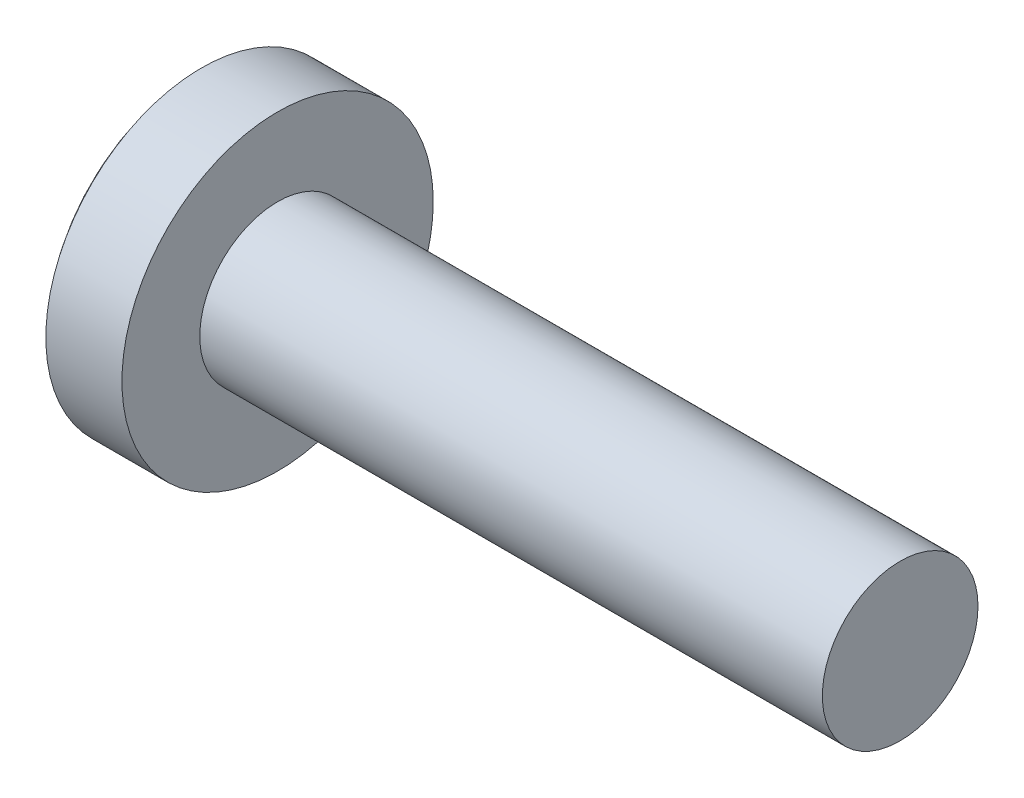
ISO-10303-21;
HEADER;
FILE_DESCRIPTION(('STEP AP214'),'2;1');
FILE_NAME('part.step','',(''),(''),'','','');
FILE_SCHEMA(('AUTOMOTIVE_DESIGN { 1 0 10303 214 1 1 1 1 }'));
ENDSEC;
DATA;
#1=APPLICATION_CONTEXT('core data for automotive mechanical design processes');
#2=APPLICATION_PROTOCOL_DEFINITION('international standard','automotive_design',2000,#1);
#3=PRODUCT_CONTEXT('',#1,'mechanical');
#4=PRODUCT('Part','Part','',(#3));
#5=PRODUCT_RELATED_PRODUCT_CATEGORY('part','',(#4));
#6=PRODUCT_DEFINITION_FORMATION('','',#4);
#7=PRODUCT_DEFINITION_CONTEXT('part definition',#1,'design');
#8=PRODUCT_DEFINITION('design','',#6,#7);
#9=PRODUCT_DEFINITION_SHAPE('','',#8);
#10=(LENGTH_UNIT() NAMED_UNIT(*) SI_UNIT(.MILLI.,.METRE.));
#11=(NAMED_UNIT(*) PLANE_ANGLE_UNIT() SI_UNIT($,.RADIAN.));
#12=(NAMED_UNIT(*) SI_UNIT($,.STERADIAN.) SOLID_ANGLE_UNIT());
#13=UNCERTAINTY_MEASURE_WITH_UNIT(LENGTH_MEASURE(1.E-05),#10,'distance_accuracy_value','');
#14=(GEOMETRIC_REPRESENTATION_CONTEXT(3) GLOBAL_UNCERTAINTY_ASSIGNED_CONTEXT((#13)) GLOBAL_UNIT_ASSIGNED_CONTEXT((#10,
#11,#12)) REPRESENTATION_CONTEXT('',''));
#15=CARTESIAN_POINT('',(0.,0.,0.));
#16=DIRECTION('',(0.,0.,1.));
#17=DIRECTION('',(1.,0.,0.));
#18=AXIS2_PLACEMENT_3D('',#15,#16,#17);
#19=CARTESIAN_POINT('',(1.47,0.27,0.27));
#20=DIRECTION('',(1.,0.,0.));
#21=DIRECTION('',(0.,0.,-1.));
#22=AXIS2_PLACEMENT_3D('',#19,#20,#21);
#23=PLANE('',#22);
#24=CARTESIAN_POINT('',(1.47,0.57,0.57));
#25=DIRECTION('',(-1.,0.,0.));
#26=DIRECTION('',(0.,0.,1.));
#27=AXIS2_PLACEMENT_3D('',#24,#25,#26);
#28=CIRCLE('',#27,0.3);
#29=CARTESIAN_POINT('',(1.47,0.501295104291248,0.277973225019264));
#30=VERTEX_POINT('',#29);
#31=CARTESIAN_POINT('',(1.47,0.277973225019264,0.501295104291247));
#32=VERTEX_POINT('',#31);
#33=EDGE_CURVE('E19',#30,#32,#28,.T.);
#34=ORIENTED_EDGE('',*,*,#33,.F.);
#35=DIRECTION('',(0.,0.,1.));
#36=VECTOR('',#35,1.);
#37=CARTESIAN_POINT('',(1.47,0.501295104291248,0.));
#38=LINE('',#37,#36);
#39=CARTESIAN_POINT('',(1.47,0.501295104291248,-0.277973225019264));
#40=VERTEX_POINT('',#39);
#41=EDGE_CURVE('E129',#40,#30,#38,.T.);
#42=ORIENTED_EDGE('',*,*,#41,.F.);
#43=CARTESIAN_POINT('',(1.47,0.57,-0.57));
#44=DIRECTION('',(-1.,0.,0.));
#45=DIRECTION('',(0.,0.,1.));
#46=AXIS2_PLACEMENT_3D('',#43,#44,#45);
#47=CIRCLE('',#46,0.3);
#48=CARTESIAN_POINT('',(1.47,0.277973225019264,-0.501295104291247));
#49=VERTEX_POINT('',#48);
#50=EDGE_CURVE('E270',#49,#40,#47,.T.);
#51=ORIENTED_EDGE('',*,*,#50,.F.);
#52=DIRECTION('',(0.,1.,0.));
#53=VECTOR('',#52,1.);
#54=CARTESIAN_POINT('',(1.47,0.,-0.501295104291247));
#55=LINE('',#54,#53);
#56=CARTESIAN_POINT('',(1.47,-0.277973225019264,-0.501295104291247));
#57=VERTEX_POINT('',#56);
#58=EDGE_CURVE('E152',#57,#49,#55,.T.);
#59=ORIENTED_EDGE('',*,*,#58,.F.);
#60=CARTESIAN_POINT('',(1.47,-0.57,-0.57));
#61=DIRECTION('',(-1.,0.,0.));
#62=DIRECTION('',(0.,0.,1.));
#63=AXIS2_PLACEMENT_3D('',#60,#61,#62);
#64=CIRCLE('',#63,0.3);
#65=CARTESIAN_POINT('',(1.47,-0.501295104291248,-0.277973225019264));
#66=VERTEX_POINT('',#65);
#67=EDGE_CURVE('E288',#66,#57,#64,.T.);
#68=ORIENTED_EDGE('',*,*,#67,.F.);
#69=DIRECTION('',(0.,0.,1.));
#70=VECTOR('',#69,1.);
#71=CARTESIAN_POINT('',(1.47,-0.501295104291248,0.));
#72=LINE('',#71,#70);
#73=CARTESIAN_POINT('',(1.47,-0.501295104291248,0.277973225019264));
#74=VERTEX_POINT('',#73);
#75=EDGE_CURVE('E157',#74,#66,#72,.F.);
#76=ORIENTED_EDGE('',*,*,#75,.F.);
#77=CARTESIAN_POINT('',(1.47,-0.57,0.57));
#78=DIRECTION('',(-1.,0.,0.));
#79=DIRECTION('',(0.,0.,1.));
#80=AXIS2_PLACEMENT_3D('',#77,#78,#79);
#81=CIRCLE('',#80,0.3);
#82=CARTESIAN_POINT('',(1.47,-0.277973225019264,0.501295104291247));
#83=VERTEX_POINT('',#82);
#84=EDGE_CURVE('E319',#83,#74,#81,.T.);
#85=ORIENTED_EDGE('',*,*,#84,.F.);
#86=DIRECTION('',(0.,1.,0.));
#87=VECTOR('',#86,1.);
#88=CARTESIAN_POINT('',(1.47,0.,0.501295104291247));
#89=LINE('',#88,#87);
#90=EDGE_CURVE('E132',#32,#83,#89,.F.);
#91=ORIENTED_EDGE('',*,*,#90,.F.);
#92=EDGE_LOOP('',(#34,#42,#51,#59,#68,#76,#85,#91));
#93=FACE_BOUND('',#92,.T.);
#94=ADVANCED_FACE('F16',(#93),#23,.F.);
#95=CARTESIAN_POINT('',(1.47,0.57,0.57));
#96=DIRECTION('',(-1.,0.,0.));
#97=DIRECTION('',(0.,0.,1.));
#98=AXIS2_PLACEMENT_3D('',#95,#96,#97);
#99=CYLINDRICAL_SURFACE('',#98,0.3);
#100=DIRECTION('',(1.,0.,0.));
#101=VECTOR('',#100,1.);
#102=CARTESIAN_POINT('',(1.47,0.57,0.27));
#103=LINE('',#102,#101);
#104=CARTESIAN_POINT('',(1.35099962990372,0.57,0.27));
#105=VERTEX_POINT('',#104);
#106=CARTESIAN_POINT('',(0.0500379748660876,0.57,0.27));
#107=VERTEX_POINT('',#106);
#108=EDGE_CURVE('E140',#105,#107,#103,.F.);
#109=ORIENTED_EDGE('',*,*,#108,.F.);
#110=CARTESIAN_POINT('',(1.35099962990372,0.57,0.57));
#111=DIRECTION('',(-0.500000000000001,-0.866025403784438,0.));
#112=DIRECTION('',(-0.866025403784438,0.500000000000001,0.));
#113=AXIS2_PLACEMENT_3D('',#110,#111,#112);
#114=ELLIPSE('',#113,0.599999999999999,0.3);
#115=EDGE_CURVE('E137',#30,#105,#114,.F.);
#116=ORIENTED_EDGE('',*,*,#115,.F.);
#117=ORIENTED_EDGE('',*,*,#33,.T.);
#118=CARTESIAN_POINT('',(1.35099962990372,0.57,0.57));
#119=DIRECTION('',(-0.500000000000001,0.,-0.866025403784438));
#120=DIRECTION('',(-0.866025403784438,0.,0.500000000000001));
#121=AXIS2_PLACEMENT_3D('',#118,#119,#120);
#122=ELLIPSE('',#121,0.599999999999999,0.3);
#123=CARTESIAN_POINT('',(1.35099962990372,0.27,0.57));
#124=VERTEX_POINT('',#123);
#125=EDGE_CURVE('E163',#124,#32,#122,.F.);
#126=ORIENTED_EDGE('',*,*,#125,.F.);
#127=DIRECTION('',(1.,0.,0.));
#128=VECTOR('',#127,1.);
#129=CARTESIAN_POINT('',(1.47,0.27,0.57));
#130=LINE('',#129,#128);
#131=CARTESIAN_POINT('',(0.0500379748660873,0.27,0.57));
#132=VERTEX_POINT('',#131);
#133=EDGE_CURVE('E342',#132,#124,#130,.T.);
#134=ORIENTED_EDGE('',*,*,#133,.F.);
#135=CARTESIAN_POINT('',(0.0500379748660873,0.269999999999999,0.57));
#136=CARTESIAN_POINT('',(0.0476365193072019,0.269985184718192,0.553373133693541));
#137=CARTESIAN_POINT('',(0.0454365535761343,0.27138160203282,0.536716442967316));
#138=CARTESIAN_POINT('',(0.041494524220516,0.276920923649693,0.503814466627408));
#139=CARTESIAN_POINT('',(0.0397523598629176,0.281063223049623,0.487569091221413));
#140=CARTESIAN_POINT('',(0.036778374566567,0.292023459728197,0.455938435457178));
#141=CARTESIAN_POINT('',(0.0355470274058542,0.298843869569156,0.440553964967674));
#142=CARTESIAN_POINT('',(0.0336346249010352,0.314973582618152,0.411119958233409));
#143=CARTESIAN_POINT('',(0.0329533539015007,0.32428190854053,0.3970699007448));
#144=CARTESIAN_POINT('',(0.0321660944268172,0.345013208977959,0.370858942562679));
#145=CARTESIAN_POINT('',(0.0320539196934614,0.356412041876083,0.358679128892844));
#146=CARTESIAN_POINT('',(0.0323915833576584,0.381063919968772,0.336377730121749));
#147=CARTESIAN_POINT('',(0.0328414084664962,0.394316921314189,0.326256096360568));
#148=CARTESIAN_POINT('',(0.0342854793268387,0.422222752109676,0.308399048507584));
#149=CARTESIAN_POINT('',(0.035277058409756,0.436868437061245,0.300652234107461));
#150=CARTESIAN_POINT('',(0.0377733495233277,0.467195795819663,0.287682728115111));
#151=CARTESIAN_POINT('',(0.0392779218148236,0.482877186563697,0.282459350075276));
#152=CARTESIAN_POINT('',(0.0422857123404821,0.510516712878049,0.275710673998405));
#153=CARTESIAN_POINT('',(0.0436802006877329,0.522340388950019,0.273568318144529));
#154=CARTESIAN_POINT('',(0.0466949687188353,0.546113272121096,0.270712687134809));
#155=CARTESIAN_POINT('',(0.0483149209970562,0.558062274372233,0.2699973624182));
#156=CARTESIAN_POINT('',(0.0500379748660879,0.57,0.27));
#157=B_SPLINE_CURVE_WITH_KNOTS('',3,(#135,#136,#137,#138,#139,#140,#141,#142,#143,#144,#145,
#146,#147,#148,#149,#150,#151,#152,#153,#154,#155,#156),.UNSPECIFIED.,.F.,.F.,(4,2,2,2,2,2,2,2,
2,2,4),(0.,0.0503402470596833,0.100669408130982,0.151045145210377,0.20140112305631,
0.251208524397358,0.301014748044423,0.350577991416719,0.400127744552091,0.436335022834785,
0.472490261189751),.UNSPECIFIED.);
#158=EDGE_CURVE('E135',#132,#107,#157,.T.);
#159=ORIENTED_EDGE('',*,*,#158,.T.);
#160=EDGE_LOOP('',(#109,#116,#117,#126,#134,#159));
#161=FACE_BOUND('',#160,.T.);
#162=ADVANCED_FACE('F138',(#161),#99,.T.);
#163=CARTESIAN_POINT('',(0.,0.,1.35));
#164=DIRECTION('',(-0.500000000000001,0.,-0.866025403784438));
#165=DIRECTION('',(-0.866025403784438,0.,0.500000000000001));
#166=AXIS2_PLACEMENT_3D('',#163,#164,#165);
#167=PLANE('',#166);
#168=DIRECTION('',(0.866025403784438,0.,-0.500000000000001));
#169=VECTOR('',#168,1.);
#170=CARTESIAN_POINT('',(0.204098003289609,-0.27,1.23216396285968));
#171=LINE('',#170,#169);
#172=CARTESIAN_POINT('',(0.204098003289609,-0.27,1.23216396285968));
#173=VERTEX_POINT('',#172);
#174=CARTESIAN_POINT('',(1.35099962990372,-0.27,0.57));
#175=VERTEX_POINT('',#174);
#176=EDGE_CURVE('E351',#173,#175,#171,.T.);
#177=ORIENTED_EDGE('',*,*,#176,.F.);
#178=CARTESIAN_POINT('',(0.204098003289609,-0.27,1.23216396285968));
#179=CARTESIAN_POINT('',(0.198713172982016,-0.18,1.23527289608731));
#180=CARTESIAN_POINT('',(0.196020757828219,-0.0900000000000002,1.23682736270112));
#181=CARTESIAN_POINT('',(0.196020757828219,0.0899999999999997,1.23682736270112));
#182=CARTESIAN_POINT('',(0.198713172982016,0.18,1.23527289608731));
#183=CARTESIAN_POINT('',(0.204098003289609,0.27,1.23216396285968));
#184=B_SPLINE_CURVE_WITH_KNOTS('',3,(#178,#179,#180,#181,#182,#183),.UNSPECIFIED.,.F.,.F.,(4,2,
4),(0.,0.27016104306936,0.54032208613872),.UNSPECIFIED.);
#185=CARTESIAN_POINT('',(0.204098003289609,0.269999999999999,1.23216396285968));
#186=VERTEX_POINT('',#185);
#187=EDGE_CURVE('E162',#173,#186,#184,.T.);
#188=ORIENTED_EDGE('',*,*,#187,.T.);
#189=DIRECTION('',(-0.866025403784438,0.,0.500000000000001));
#190=VECTOR('',#189,1.);
#191=CARTESIAN_POINT('',(1.35099962990372,0.27,0.57));
#192=LINE('',#191,#190);
#193=EDGE_CURVE('E340',#124,#186,#192,.T.);
#194=ORIENTED_EDGE('',*,*,#193,.F.);
#195=ORIENTED_EDGE('',*,*,#125,.T.);
#196=ORIENTED_EDGE('',*,*,#90,.T.);
#197=CARTESIAN_POINT('',(1.35099962990372,-0.57,0.57));
#198=DIRECTION('',(-0.500000000000001,0.,-0.866025403784438));
#199=DIRECTION('',(-0.866025403784438,0.,0.500000000000001));
#200=AXIS2_PLACEMENT_3D('',#197,#198,#199);
#201=ELLIPSE('',#200,0.599999999999999,0.3);
#202=EDGE_CURVE('E310',#175,#83,#201,.T.);
#203=ORIENTED_EDGE('',*,*,#202,.F.);
#204=EDGE_LOOP('',(#177,#188,#194,#195,#196,#203));
#205=FACE_BOUND('',#204,.T.);
#206=ADVANCED_FACE('F326',(#205),#167,.T.);
#207=CARTESIAN_POINT('',(1.47,-0.57,0.57));
#208=DIRECTION('',(-1.,0.,0.));
#209=DIRECTION('',(0.,0.,1.));
#210=AXIS2_PLACEMENT_3D('',#207,#208,#209);
#211=CYLINDRICAL_SURFACE('',#210,0.3);
#212=DIRECTION('',(1.,0.,0.));
#213=VECTOR('',#212,1.);
#214=CARTESIAN_POINT('',(1.47,-0.27,0.57));
#215=LINE('',#214,#213);
#216=CARTESIAN_POINT('',(0.0500379748660873,-0.27,0.57));
#217=VERTEX_POINT('',#216);
#218=EDGE_CURVE('E354',#175,#217,#215,.F.);
#219=ORIENTED_EDGE('',*,*,#218,.F.);
#220=ORIENTED_EDGE('',*,*,#202,.T.);
#221=ORIENTED_EDGE('',*,*,#84,.T.);
#222=CARTESIAN_POINT('',(1.35099962990372,-0.57,0.57));
#223=DIRECTION('',(-0.500000000000001,0.866025403784438,0.));
#224=DIRECTION('',(-0.866025403784438,-0.500000000000001,0.));
#225=AXIS2_PLACEMENT_3D('',#222,#223,#224);
#226=ELLIPSE('',#225,0.599999999999999,0.3);
#227=CARTESIAN_POINT('',(1.35099962990372,-0.57,0.27));
#228=VERTEX_POINT('',#227);
#229=EDGE_CURVE('E161',#228,#74,#226,.F.);
#230=ORIENTED_EDGE('',*,*,#229,.F.);
#231=DIRECTION('',(1.,0.,0.));
#232=VECTOR('',#231,1.);
#233=CARTESIAN_POINT('',(1.47,-0.57,0.27));
#234=LINE('',#233,#232);
#235=CARTESIAN_POINT('',(0.0500379748660876,-0.57,0.27));
#236=VERTEX_POINT('',#235);
#237=EDGE_CURVE('E357',#236,#228,#234,.T.);
#238=ORIENTED_EDGE('',*,*,#237,.F.);
#239=CARTESIAN_POINT('',(0.0500379748660879,-0.57,0.27));
#240=CARTESIAN_POINT('',(0.0476365193072021,-0.55337313369354,0.269985184718192));
#241=CARTESIAN_POINT('',(0.0454365535761344,-0.536716442967315,0.27138160203282));
#242=CARTESIAN_POINT('',(0.0414945242205159,-0.503814466627406,0.276920923649694));
#243=CARTESIAN_POINT('',(0.0397523598629175,-0.487569091221411,0.281063223049624));
#244=CARTESIAN_POINT('',(0.0367783745665669,-0.455938435457174,0.292023459728199));
#245=CARTESIAN_POINT('',(0.0355470274058541,-0.44055396496767,0.298843869569159));
#246=CARTESIAN_POINT('',(0.0336346249010354,-0.411119958233404,0.314973582618155));
#247=CARTESIAN_POINT('',(0.0329533539015011,-0.397069900744794,0.324281908540533));
#248=CARTESIAN_POINT('',(0.0321660944268181,-0.370858942562674,0.345013208977963));
#249=CARTESIAN_POINT('',(0.0320539196934626,-0.358679128892839,0.356412041876088));
#250=CARTESIAN_POINT('',(0.0323915833576594,-0.336377730121745,0.381063919968777));
#251=CARTESIAN_POINT('',(0.0328414084664968,-0.326256096360564,0.394316921314194));
#252=CARTESIAN_POINT('',(0.0342854793268392,-0.30839904850758,0.422222752109682));
#253=CARTESIAN_POINT('',(0.0352770584097568,-0.300652234107457,0.436868437061251));
#254=CARTESIAN_POINT('',(0.0377733495233286,-0.287682728115109,0.46719579581967));
#255=CARTESIAN_POINT('',(0.0392779218148242,-0.282459350075275,0.482877186563704));
#256=CARTESIAN_POINT('',(0.0422857123404829,-0.275710673998405,0.510516712878055));
#257=CARTESIAN_POINT('',(0.0436802006877339,-0.273568318144529,0.522340388950024));
#258=CARTESIAN_POINT('',(0.0466949687188361,-0.270712687134809,0.546113272121098));
#259=CARTESIAN_POINT('',(0.0483149209970567,-0.2699973624182,0.558062274372233));
#260=CARTESIAN_POINT('',(0.0500379748660873,-0.27,0.57));
#261=B_SPLINE_CURVE_WITH_KNOTS('',3,(#239,#240,#241,#242,#243,#244,#245,#246,#247,#248,#249,
#250,#251,#252,#253,#254,#255,#256,#257,#258,#259,#260),.UNSPECIFIED.,.F.,.F.,(4,2,2,2,2,2,2,2,
2,2,4),(0.,0.0503402470596851,0.100669408130986,0.151045145210383,0.201401123056317,
0.251208524397365,0.30101474804443,0.350577991416726,0.400127744552098,0.436335022834788,
0.47249026118975),.UNSPECIFIED.);
#262=EDGE_CURVE('E313',#236,#217,#261,.T.);
#263=ORIENTED_EDGE('',*,*,#262,.T.);
#264=EDGE_LOOP('',(#219,#220,#221,#230,#238,#263));
#265=FACE_BOUND('',#264,.T.);
#266=ADVANCED_FACE('F299',(#265),#211,.T.);
#267=CARTESIAN_POINT('',(0.,-1.35,0.));
#268=DIRECTION('',(-0.500000000000001,0.866025403784438,0.));
#269=DIRECTION('',(-0.866025403784438,-0.500000000000001,0.));
#270=AXIS2_PLACEMENT_3D('',#267,#268,#269);
#271=PLANE('',#270);
#272=DIRECTION('',(0.866025403784438,0.500000000000001,0.));
#273=VECTOR('',#272,1.);
#274=CARTESIAN_POINT('',(0.204098003289609,-1.23216396285968,-0.27));
#275=LINE('',#274,#273);
#276=CARTESIAN_POINT('',(0.204098003289609,-1.23216396285968,-0.270000000000001));
#277=VERTEX_POINT('',#276);
#278=CARTESIAN_POINT('',(1.35099962990372,-0.57,-0.27));
#279=VERTEX_POINT('',#278);
#280=EDGE_CURVE('E363',#277,#279,#275,.T.);
#281=ORIENTED_EDGE('',*,*,#280,.F.);
#282=CARTESIAN_POINT('',(0.20409800328961,-1.23216396285968,-0.270000000000002));
#283=CARTESIAN_POINT('',(0.198713172982015,-1.2352728960873,-0.180000000000001));
#284=CARTESIAN_POINT('',(0.196020757828219,-1.23682736270112,-0.0900000000000005));
#285=CARTESIAN_POINT('',(0.196020757828222,-1.23682736270113,0.0900000000000011));
#286=CARTESIAN_POINT('',(0.198713172982022,-1.23527289608732,0.180000000000002));
#287=CARTESIAN_POINT('',(0.204098003289619,-1.2321639628597,0.270000000000003));
#288=B_SPLINE_CURVE_WITH_KNOTS('',3,(#282,#283,#284,#285,#286,#287),.UNSPECIFIED.,.F.,.F.,(4,2,
4),(0.,0.270161043069362,0.540322086138725),.UNSPECIFIED.);
#289=CARTESIAN_POINT('',(0.204098003289609,-1.23216396285968,0.269999999999999));
#290=VERTEX_POINT('',#289);
#291=EDGE_CURVE('E160',#277,#290,#288,.T.);
#292=ORIENTED_EDGE('',*,*,#291,.T.);
#293=DIRECTION('',(-0.866025403784438,-0.500000000000001,0.));
#294=VECTOR('',#293,1.);
#295=CARTESIAN_POINT('',(1.35099962990372,-0.57,0.27));
#296=LINE('',#295,#294);
#297=EDGE_CURVE('E360',#228,#290,#296,.T.);
#298=ORIENTED_EDGE('',*,*,#297,.F.);
#299=ORIENTED_EDGE('',*,*,#229,.T.);
#300=ORIENTED_EDGE('',*,*,#75,.T.);
#301=CARTESIAN_POINT('',(1.35099962990372,-0.57,-0.57));
#302=DIRECTION('',(-0.500000000000001,0.866025403784438,0.));
#303=DIRECTION('',(-0.866025403784438,-0.500000000000001,0.));
#304=AXIS2_PLACEMENT_3D('',#301,#302,#303);
#305=ELLIPSE('',#304,0.599999999999999,0.3);
#306=EDGE_CURVE('E279',#279,#66,#305,.T.);
#307=ORIENTED_EDGE('',*,*,#306,.F.);
#308=EDGE_LOOP('',(#281,#292,#298,#299,#300,#307));
#309=FACE_BOUND('',#308,.T.);
#310=ADVANCED_FACE('F294',(#309),#271,.T.);
#311=CARTESIAN_POINT('',(1.47,-0.57,-0.57));
#312=DIRECTION('',(-1.,0.,0.));
#313=DIRECTION('',(0.,0.,1.));
#314=AXIS2_PLACEMENT_3D('',#311,#312,#313);
#315=CYLINDRICAL_SURFACE('',#314,0.3);
#316=DIRECTION('',(1.,0.,0.));
#317=VECTOR('',#316,1.);
#318=CARTESIAN_POINT('',(1.47,-0.57,-0.27));
#319=LINE('',#318,#317);
#320=CARTESIAN_POINT('',(0.0500379748660876,-0.57,-0.269999999999999));
#321=VERTEX_POINT('',#320);
#322=EDGE_CURVE('E366',#279,#321,#319,.F.);
#323=ORIENTED_EDGE('',*,*,#322,.F.);
#324=ORIENTED_EDGE('',*,*,#306,.T.);
#325=ORIENTED_EDGE('',*,*,#67,.T.);
#326=CARTESIAN_POINT('',(1.35099962990372,-0.57,-0.57));
#327=DIRECTION('',(-0.500000000000001,0.,0.866025403784438));
#328=DIRECTION('',(-0.866025403784438,0.,-0.500000000000001));
#329=AXIS2_PLACEMENT_3D('',#326,#327,#328);
#330=ELLIPSE('',#329,0.599999999999999,0.3);
#331=CARTESIAN_POINT('',(1.35099962990372,-0.27,-0.57));
#332=VERTEX_POINT('',#331);
#333=EDGE_CURVE('E156',#332,#57,#330,.F.);
#334=ORIENTED_EDGE('',*,*,#333,.F.);
#335=DIRECTION('',(1.,0.,0.));
#336=VECTOR('',#335,1.);
#337=CARTESIAN_POINT('',(1.47,-0.27,-0.57));
#338=LINE('',#337,#336);
#339=CARTESIAN_POINT('',(0.0500379748660873,-0.27,-0.57));
#340=VERTEX_POINT('',#339);
#341=EDGE_CURVE('E369',#340,#332,#338,.T.);
#342=ORIENTED_EDGE('',*,*,#341,.F.);
#343=CARTESIAN_POINT('',(0.0500379748660873,-0.27,-0.57));
#344=CARTESIAN_POINT('',(0.0476365193072022,-0.269985184718193,-0.55337313369354));
#345=CARTESIAN_POINT('',(0.0454365535761345,-0.271381602032821,-0.536716442967315));
#346=CARTESIAN_POINT('',(0.0414945242205158,-0.276920923649694,-0.503814466627407));
#347=CARTESIAN_POINT('',(0.0397523598629172,-0.281063223049624,-0.487569091221412));
#348=CARTESIAN_POINT('',(0.0367783745665666,-0.292023459728197,-0.455938435457177));
#349=CARTESIAN_POINT('',(0.0355470274058541,-0.298843869569157,-0.440553964967672));
#350=CARTESIAN_POINT('',(0.0336346249010354,-0.314973582618153,-0.411119958233408));
#351=CARTESIAN_POINT('',(0.0329533539015008,-0.324281908540531,-0.397069900744799));
#352=CARTESIAN_POINT('',(0.0321660944268171,-0.345013208977961,-0.370858942562678));
#353=CARTESIAN_POINT('',(0.0320539196934611,-0.356412041876085,-0.358679128892843));
#354=CARTESIAN_POINT('',(0.0323915833576587,-0.381063919968774,-0.336377730121748));
#355=CARTESIAN_POINT('',(0.0328414084664972,-0.394316921314191,-0.326256096360567));
#356=CARTESIAN_POINT('',(0.0342854793268394,-0.422222752109678,-0.308399048507582));
#357=CARTESIAN_POINT('',(0.0352770584097559,-0.436868437061247,-0.300652234107459));
#358=CARTESIAN_POINT('',(0.0377733495233277,-0.467195795819665,-0.287682728115112));
#359=CARTESIAN_POINT('',(0.0392779218148245,-0.4828771865637,-0.282459350075278));
#360=CARTESIAN_POINT('',(0.042285712340483,-0.510516712878051,-0.275710673998406));
#361=CARTESIAN_POINT('',(0.0436802006877333,-0.522340388950022,-0.27356831814453));
#362=CARTESIAN_POINT('',(0.0466949687188349,-0.546113272121098,-0.270712687134808));
#363=CARTESIAN_POINT('',(0.0483149209970557,-0.558062274372234,-0.269997362418198));
#364=CARTESIAN_POINT('',(0.0500379748660879,-0.570000000000001,-0.269999999999998));
#365=B_SPLINE_CURVE_WITH_KNOTS('',3,(#343,#344,#345,#346,#347,#348,#349,#350,#351,#352,#353,
#354,#355,#356,#357,#358,#359,#360,#361,#362,#363,#364),.UNSPECIFIED.,.F.,.F.,(4,2,2,2,2,2,2,2,
2,2,4),(0.,0.0503402470596843,0.100669408130984,0.151045145210379,0.201401123056311,
0.25120852439736,0.301014748044425,0.35057799141672,0.400127744552093,0.436335022834786,
0.472490261189751),.UNSPECIFIED.);
#366=EDGE_CURVE('E282',#340,#321,#365,.T.);
#367=ORIENTED_EDGE('',*,*,#366,.T.);
#368=EDGE_LOOP('',(#323,#324,#325,#334,#342,#367));
#369=FACE_BOUND('',#368,.T.);
#370=ADVANCED_FACE('F290',(#369),#315,.T.);
#371=CARTESIAN_POINT('',(0.,0.,-1.35));
#372=DIRECTION('',(-0.500000000000001,0.,0.866025403784438));
#373=DIRECTION('',(0.866025403784438,0.,0.500000000000001));
#374=AXIS2_PLACEMENT_3D('',#371,#372,#373);
#375=PLANE('',#374);
#376=DIRECTION('',(0.866025403784438,0.,0.500000000000001));
#377=VECTOR('',#376,1.);
#378=CARTESIAN_POINT('',(0.204098003289609,0.27,-1.23216396285968));
#379=LINE('',#378,#377);
#380=CARTESIAN_POINT('',(0.204098003289609,0.27,-1.23216396285968));
#381=VERTEX_POINT('',#380);
#382=CARTESIAN_POINT('',(1.35099962990372,0.27,-0.57));
#383=VERTEX_POINT('',#382);
#384=EDGE_CURVE('E375',#381,#383,#379,.T.);
#385=ORIENTED_EDGE('',*,*,#384,.F.);
#386=CARTESIAN_POINT('',(0.204098003289608,0.27,-1.23216396285968));
#387=CARTESIAN_POINT('',(0.198713172982016,0.18,-1.23527289608731));
#388=CARTESIAN_POINT('',(0.196020757828219,0.0899999999999997,-1.23682736270112));
#389=CARTESIAN_POINT('',(0.196020757828219,-0.0900000000000001,-1.23682736270112));
#390=CARTESIAN_POINT('',(0.198713172982015,-0.18,-1.23527289608731));
#391=CARTESIAN_POINT('',(0.204098003289608,-0.27,-1.23216396285968));
#392=B_SPLINE_CURVE_WITH_KNOTS('',3,(#386,#387,#388,#389,#390,#391),.UNSPECIFIED.,.F.,.F.,(4,2,
4),(0.,0.27016104306936,0.54032208613872),.UNSPECIFIED.);
#393=CARTESIAN_POINT('',(0.204098003289609,-0.27,-1.23216396285968));
#394=VERTEX_POINT('',#393);
#395=EDGE_CURVE('E155',#381,#394,#392,.T.);
#396=ORIENTED_EDGE('',*,*,#395,.T.);
#397=DIRECTION('',(-0.866025403784438,0.,-0.500000000000001));
#398=VECTOR('',#397,1.);
#399=CARTESIAN_POINT('',(1.35099962990372,-0.27,-0.57));
#400=LINE('',#399,#398);
#401=EDGE_CURVE('E372',#332,#394,#400,.T.);
#402=ORIENTED_EDGE('',*,*,#401,.F.);
#403=ORIENTED_EDGE('',*,*,#333,.T.);
#404=ORIENTED_EDGE('',*,*,#58,.T.);
#405=CARTESIAN_POINT('',(1.35099962990372,0.57,-0.57));
#406=DIRECTION('',(-0.500000000000001,0.,0.866025403784438));
#407=DIRECTION('',(-0.866025403784438,0.,-0.500000000000001));
#408=AXIS2_PLACEMENT_3D('',#405,#406,#407);
#409=ELLIPSE('',#408,0.599999999999999,0.3);
#410=EDGE_CURVE('E146',#383,#49,#409,.T.);
#411=ORIENTED_EDGE('',*,*,#410,.F.);
#412=EDGE_LOOP('',(#385,#396,#402,#403,#404,#411));
#413=FACE_BOUND('',#412,.T.);
#414=ADVANCED_FACE('F258',(#413),#375,.T.);
#415=CARTESIAN_POINT('',(1.47,0.57,-0.57));
#416=DIRECTION('',(-1.,0.,0.));
#417=DIRECTION('',(0.,0.,1.));
#418=AXIS2_PLACEMENT_3D('',#415,#416,#417);
#419=CYLINDRICAL_SURFACE('',#418,0.3);
#420=DIRECTION('',(1.,0.,0.));
#421=VECTOR('',#420,1.);
#422=CARTESIAN_POINT('',(1.47,0.27,-0.57));
#423=LINE('',#422,#421);
#424=CARTESIAN_POINT('',(0.0500379748660873,0.269999999999999,-0.57));
#425=VERTEX_POINT('',#424);
#426=EDGE_CURVE('E378',#383,#425,#423,.F.);
#427=ORIENTED_EDGE('',*,*,#426,.F.);
#428=ORIENTED_EDGE('',*,*,#410,.T.);
#429=ORIENTED_EDGE('',*,*,#50,.T.);
#430=CARTESIAN_POINT('',(1.35099962990372,0.57,-0.57));
#431=DIRECTION('',(-0.500000000000001,-0.866025403784438,0.));
#432=DIRECTION('',(-0.866025403784438,0.500000000000001,0.));
#433=AXIS2_PLACEMENT_3D('',#430,#431,#432);
#434=ELLIPSE('',#433,0.599999999999999,0.3);
#435=CARTESIAN_POINT('',(1.35099962990372,0.57,-0.27));
#436=VERTEX_POINT('',#435);
#437=EDGE_CURVE('E144',#436,#40,#434,.F.);
#438=ORIENTED_EDGE('',*,*,#437,.F.);
#439=DIRECTION('',(1.,0.,0.));
#440=VECTOR('',#439,1.);
#441=CARTESIAN_POINT('',(1.47,0.57,-0.27));
#442=LINE('',#441,#440);
#443=CARTESIAN_POINT('',(0.0500379748660876,0.57,-0.269999999999999));
#444=VERTEX_POINT('',#443);
#445=EDGE_CURVE('E381',#444,#436,#442,.T.);
#446=ORIENTED_EDGE('',*,*,#445,.F.);
#447=CARTESIAN_POINT('',(0.0500379748660879,0.57,-0.269999999999998));
#448=CARTESIAN_POINT('',(0.0476365193072021,0.55337313369354,-0.269985184718191));
#449=CARTESIAN_POINT('',(0.0454365535761343,0.536716442967316,-0.27138160203282));
#450=CARTESIAN_POINT('',(0.0414945242205158,0.503814466627407,-0.276920923649695));
#451=CARTESIAN_POINT('',(0.0397523598629175,0.487569091221411,-0.281063223049626));
#452=CARTESIAN_POINT('',(0.036778374566567,0.455938435457175,-0.2920234597282));
#453=CARTESIAN_POINT('',(0.0355470274058542,0.44055396496767,-0.29884386956916));
#454=CARTESIAN_POINT('',(0.0336346249010353,0.411119958233404,-0.314973582618154));
#455=CARTESIAN_POINT('',(0.0329533539015007,0.397069900744794,-0.324281908540531));
#456=CARTESIAN_POINT('',(0.0321660944268176,0.370858942562673,-0.345013208977961));
#457=CARTESIAN_POINT('',(0.0320539196934623,0.358679128892839,-0.356412041876087));
#458=CARTESIAN_POINT('',(0.0323915833576596,0.336377730121746,-0.381063919968778));
#459=CARTESIAN_POINT('',(0.0328414084664973,0.326256096360565,-0.394316921314196));
#460=CARTESIAN_POINT('',(0.0342854793268396,0.308399048507581,-0.422222752109684));
#461=CARTESIAN_POINT('',(0.035277058409757,0.300652234107458,-0.436868437061252));
#462=CARTESIAN_POINT('',(0.0377733495233285,0.287682728115109,-0.46719579581967));
#463=CARTESIAN_POINT('',(0.0392779218148241,0.282459350075274,-0.482877186563704));
#464=CARTESIAN_POINT('',(0.0422857123404829,0.275710673998403,-0.510516712878054));
#465=CARTESIAN_POINT('',(0.0436802006877339,0.273568318144529,-0.522340388950023));
#466=CARTESIAN_POINT('',(0.0466949687188361,0.270712687134809,-0.546113272121098));
#467=CARTESIAN_POINT('',(0.0483149209970568,0.2699973624182,-0.558062274372233));
#468=CARTESIAN_POINT('',(0.0500379748660873,0.269999999999999,-0.57));
#469=B_SPLINE_CURVE_WITH_KNOTS('',3,(#447,#448,#449,#450,#451,#452,#453,#454,#455,#456,#457,
#458,#459,#460,#461,#462,#463,#464,#465,#466,#467,#468),.UNSPECIFIED.,.F.,.F.,(4,2,2,2,2,2,2,2,
2,2,4),(0.,0.0503402470596844,0.100669408130986,0.151045145210383,0.201401123056316,
0.251208524397365,0.301014748044431,0.350577991416726,0.400127744552097,0.436335022834788,
0.47249026118975),.UNSPECIFIED.);
#470=EDGE_CURVE('E263',#444,#425,#469,.T.);
#471=ORIENTED_EDGE('',*,*,#470,.T.);
#472=EDGE_LOOP('',(#427,#428,#429,#438,#446,#471));
#473=FACE_BOUND('',#472,.T.);
#474=ADVANCED_FACE('F254',(#473),#419,.T.);
#475=CARTESIAN_POINT('',(0.,1.35,0.));
#476=DIRECTION('',(-0.500000000000001,-0.866025403784438,0.));
#477=DIRECTION('',(0.866025403784438,-0.500000000000001,0.));
#478=AXIS2_PLACEMENT_3D('',#475,#476,#477);
#479=PLANE('',#478);
#480=DIRECTION('',(0.866025403784438,-0.500000000000001,0.));
#481=VECTOR('',#480,1.);
#482=CARTESIAN_POINT('',(0.204098003289609,1.23216396285968,0.27));
#483=LINE('',#482,#481);
#484=CARTESIAN_POINT('',(0.204098003289609,1.23216396285968,0.27));
#485=VERTEX_POINT('',#484);
#486=EDGE_CURVE('E150',#485,#105,#483,.T.);
#487=ORIENTED_EDGE('',*,*,#486,.F.);
#488=CARTESIAN_POINT('',(0.20409800328961,1.23216396285968,0.27));
#489=CARTESIAN_POINT('',(0.198713172982015,1.2352728960873,0.18));
#490=CARTESIAN_POINT('',(0.196020757828219,1.23682736270112,0.0900000000000001));
#491=CARTESIAN_POINT('',(0.196020757828222,1.23682736270113,-0.0900000000000026));
#492=CARTESIAN_POINT('',(0.198713172982022,1.23527289608732,-0.180000000000005));
#493=CARTESIAN_POINT('',(0.20409800328962,1.2321639628597,-0.270000000000008));
#494=B_SPLINE_CURVE_WITH_KNOTS('',3,(#488,#489,#490,#491,#492,#493),.UNSPECIFIED.,.F.,.F.,(4,2,
4),(0.,0.27016104306936,0.540322086138729),.UNSPECIFIED.);
#495=CARTESIAN_POINT('',(0.204098003289609,1.23216396285968,-0.270000000000001));
#496=VERTEX_POINT('',#495);
#497=EDGE_CURVE('E34',#485,#496,#494,.T.);
#498=ORIENTED_EDGE('',*,*,#497,.T.);
#499=DIRECTION('',(-0.866025403784438,0.500000000000001,0.));
#500=VECTOR('',#499,1.);
#501=CARTESIAN_POINT('',(1.35099962990372,0.57,-0.27));
#502=LINE('',#501,#500);
#503=EDGE_CURVE('E239',#436,#496,#502,.T.);
#504=ORIENTED_EDGE('',*,*,#503,.F.);
#505=ORIENTED_EDGE('',*,*,#437,.T.);
#506=ORIENTED_EDGE('',*,*,#41,.T.);
#507=ORIENTED_EDGE('',*,*,#115,.T.);
#508=EDGE_LOOP('',(#487,#498,#504,#505,#506,#507));
#509=FACE_BOUND('',#508,.T.);
#510=ADVANCED_FACE('F143',(#509),#479,.T.);
#511=CARTESIAN_POINT('',(1.47,0.27,0.27));
#512=DIRECTION('',(0.,0.,-1.));
#513=DIRECTION('',(0.,1.,0.));
#514=AXIS2_PLACEMENT_3D('',#511,#512,#513);
#515=PLANE('',#514);
#516=ORIENTED_EDGE('',*,*,#108,.T.);
#517=CARTESIAN_POINT('',(0.20409800328961,1.23216396285968,0.27));
#518=CARTESIAN_POINT('',(0.169004199271526,1.12399430612169,0.270000000000004));
#519=CARTESIAN_POINT('',(0.138618961560524,1.01472914751439,0.270000000000004));
#520=CARTESIAN_POINT('',(0.0872656187526844,0.794007826561177,0.269999999999996));
#521=CARTESIAN_POINT('',(0.0662975136558463,0.682551664215258,0.269999999999989));
#522=CARTESIAN_POINT('',(0.0500379748660901,0.570000000000027,0.269999999999979));
#523=B_SPLINE_CURVE_WITH_KNOTS('',3,(#517,#518,#519,#520,#521,#522),.UNSPECIFIED.,.F.,.F.,(4,2,
4),(0.,0.340234092950851,0.680468185901701),.UNSPECIFIED.);
#524=EDGE_CURVE('E231',#485,#107,#523,.T.);
#525=ORIENTED_EDGE('',*,*,#524,.F.);
#526=ORIENTED_EDGE('',*,*,#486,.T.);
#527=EDGE_LOOP('',(#516,#525,#526));
#528=FACE_BOUND('',#527,.T.);
#529=ADVANCED_FACE('F245',(#528),#515,.T.);
#530=CARTESIAN_POINT('',(1.47,0.27,0.27));
#531=DIRECTION('',(0.,-1.,0.));
#532=DIRECTION('',(0.,0.,-1.));
#533=AXIS2_PLACEMENT_3D('',#530,#531,#532);
#534=PLANE('',#533);
#535=ORIENTED_EDGE('',*,*,#133,.T.);
#536=ORIENTED_EDGE('',*,*,#193,.T.);
#537=CARTESIAN_POINT('',(4.,0.27,0.));
#538=DIRECTION('',(0.,1.,0.));
#539=DIRECTION('',(0.,0.,1.));
#540=AXIS2_PLACEMENT_3D('',#537,#538,#539);
#541=CIRCLE('',#540,3.99087709657915);
#542=EDGE_CURVE('E228',#132,#186,#541,.T.);
#543=ORIENTED_EDGE('',*,*,#542,.F.);
#544=EDGE_LOOP('',(#535,#536,#543));
#545=FACE_BOUND('',#544,.T.);
#546=ADVANCED_FACE('F249',(#545),#534,.T.);
#547=CARTESIAN_POINT('',(1.47,-0.27,0.27));
#548=DIRECTION('',(0.,1.,0.));
#549=DIRECTION('',(0.,0.,1.));
#550=AXIS2_PLACEMENT_3D('',#547,#548,#549);
#551=PLANE('',#550);
#552=ORIENTED_EDGE('',*,*,#218,.T.);
#553=CARTESIAN_POINT('',(4.,-0.27,0.));
#554=DIRECTION('',(0.,1.,0.));
#555=DIRECTION('',(0.,0.,1.));
#556=AXIS2_PLACEMENT_3D('',#553,#554,#555);
#557=CIRCLE('',#556,3.99087709657915);
#558=EDGE_CURVE('E225',#173,#217,#557,.F.);
#559=ORIENTED_EDGE('',*,*,#558,.F.);
#560=ORIENTED_EDGE('',*,*,#176,.T.);
#561=EDGE_LOOP('',(#552,#559,#560));
#562=FACE_BOUND('',#561,.T.);
#563=ADVANCED_FACE('F407',(#562),#551,.T.);
#564=CARTESIAN_POINT('',(1.47,-0.27,0.27));
#565=DIRECTION('',(0.,0.,-1.));
#566=DIRECTION('',(0.,1.,0.));
#567=AXIS2_PLACEMENT_3D('',#564,#565,#566);
#568=PLANE('',#567);
#569=ORIENTED_EDGE('',*,*,#237,.T.);
#570=ORIENTED_EDGE('',*,*,#297,.T.);
#571=CARTESIAN_POINT('',(0.0500379748660879,-0.57,0.27));
#572=CARTESIAN_POINT('',(0.0662975136558428,-0.682551664215235,0.27));
#573=CARTESIAN_POINT('',(0.0872656187526803,-0.794007826561159,0.27));
#574=CARTESIAN_POINT('',(0.138618961560521,-1.01472914751439,0.27));
#575=CARTESIAN_POINT('',(0.169004199271524,-1.12399430612169,0.27));
#576=CARTESIAN_POINT('',(0.20409800328961,-1.23216396285968,0.269999999999999));
#577=B_SPLINE_CURVE_WITH_KNOTS('',3,(#571,#572,#573,#574,#575,#576),.UNSPECIFIED.,.F.,.F.,(4,2,
4),(0.,0.340234092950864,0.680468185901728),.UNSPECIFIED.);
#578=EDGE_CURVE('E218',#236,#290,#577,.T.);
#579=ORIENTED_EDGE('',*,*,#578,.F.);
#580=EDGE_LOOP('',(#569,#570,#579));
#581=FACE_BOUND('',#580,.T.);
#582=ADVANCED_FACE('F205',(#581),#568,.T.);
#583=CARTESIAN_POINT('',(1.47,-0.27,-0.27));
#584=DIRECTION('',(0.,0.,1.));
#585=DIRECTION('',(1.,0.,0.));
#586=AXIS2_PLACEMENT_3D('',#583,#584,#585);
#587=PLANE('',#586);
#588=ORIENTED_EDGE('',*,*,#322,.T.);
#589=CARTESIAN_POINT('',(0.20409800328961,-1.23216396285968,-0.270000000000002));
#590=CARTESIAN_POINT('',(0.169004199271526,-1.12399430612169,-0.270000000000005));
#591=CARTESIAN_POINT('',(0.138618961560524,-1.01472914751439,-0.270000000000004));
#592=CARTESIAN_POINT('',(0.0872656187526837,-0.794007826561177,-0.269999999999996));
#593=CARTESIAN_POINT('',(0.0662975136558457,-0.682551664215257,-0.269999999999989));
#594=CARTESIAN_POINT('',(0.0500379748660896,-0.570000000000027,-0.269999999999978));
#595=B_SPLINE_CURVE_WITH_KNOTS('',3,(#589,#590,#591,#592,#593,#594),.UNSPECIFIED.,.F.,.F.,(4,2,
4),(0.,0.340234092950851,0.680468185901701),.UNSPECIFIED.);
#596=EDGE_CURVE('E210',#277,#321,#595,.T.);
#597=ORIENTED_EDGE('',*,*,#596,.F.);
#598=ORIENTED_EDGE('',*,*,#280,.T.);
#599=EDGE_LOOP('',(#588,#597,#598));
#600=FACE_BOUND('',#599,.T.);
#601=ADVANCED_FACE('F200',(#600),#587,.T.);
#602=CARTESIAN_POINT('',(1.47,-0.27,-0.27));
#603=DIRECTION('',(0.,1.,0.));
#604=DIRECTION('',(0.,0.,1.));
#605=AXIS2_PLACEMENT_3D('',#602,#603,#604);
#606=PLANE('',#605);
#607=ORIENTED_EDGE('',*,*,#341,.T.);
#608=ORIENTED_EDGE('',*,*,#401,.T.);
#609=CARTESIAN_POINT('',(4.,-0.27,0.));
#610=DIRECTION('',(0.,1.,0.));
#611=DIRECTION('',(0.,0.,1.));
#612=AXIS2_PLACEMENT_3D('',#609,#610,#611);
#613=CIRCLE('',#612,3.99087709657915);
#614=EDGE_CURVE('E217',#340,#394,#613,.F.);
#615=ORIENTED_EDGE('',*,*,#614,.F.);
#616=EDGE_LOOP('',(#607,#608,#615));
#617=FACE_BOUND('',#616,.T.);
#618=ADVANCED_FACE('F196',(#617),#606,.T.);
#619=CARTESIAN_POINT('',(1.47,0.27,-0.27));
#620=DIRECTION('',(0.,-1.,0.));
#621=DIRECTION('',(0.,0.,-1.));
#622=AXIS2_PLACEMENT_3D('',#619,#620,#621);
#623=PLANE('',#622);
#624=ORIENTED_EDGE('',*,*,#426,.T.);
#625=CARTESIAN_POINT('',(4.,0.27,0.));
#626=DIRECTION('',(0.,1.,0.));
#627=DIRECTION('',(0.,0.,1.));
#628=AXIS2_PLACEMENT_3D('',#625,#626,#627);
#629=CIRCLE('',#628,3.99087709657915);
#630=EDGE_CURVE('E182',#381,#425,#629,.T.);
#631=ORIENTED_EDGE('',*,*,#630,.F.);
#632=ORIENTED_EDGE('',*,*,#384,.T.);
#633=EDGE_LOOP('',(#624,#631,#632));
#634=FACE_BOUND('',#633,.T.);
#635=ADVANCED_FACE('F192',(#634),#623,.T.);
#636=CARTESIAN_POINT('',(1.47,0.27,-0.27));
#637=DIRECTION('',(0.,0.,1.));
#638=DIRECTION('',(1.,0.,0.));
#639=AXIS2_PLACEMENT_3D('',#636,#637,#638);
#640=PLANE('',#639);
#641=ORIENTED_EDGE('',*,*,#445,.T.);
#642=ORIENTED_EDGE('',*,*,#503,.T.);
#643=CARTESIAN_POINT('',(0.0500379748660879,0.57,-0.269999999999998));
#644=CARTESIAN_POINT('',(0.0662975136558429,0.682551664215235,-0.269999999999999));
#645=CARTESIAN_POINT('',(0.0872656187526804,0.794007826561159,-0.27));
#646=CARTESIAN_POINT('',(0.138618961560521,1.01472914751439,-0.270000000000001));
#647=CARTESIAN_POINT('',(0.169004199271524,1.12399430612169,-0.270000000000001));
#648=CARTESIAN_POINT('',(0.204098003289609,1.23216396285968,-0.270000000000002));
#649=B_SPLINE_CURVE_WITH_KNOTS('',3,(#643,#644,#645,#646,#647,#648),.UNSPECIFIED.,.F.,.F.,(4,2,
4),(0.,0.340234092950864,0.680468185901728),.UNSPECIFIED.);
#650=EDGE_CURVE('E173',#444,#496,#649,.T.);
#651=ORIENTED_EDGE('',*,*,#650,.F.);
#652=EDGE_LOOP('',(#641,#642,#651));
#653=FACE_BOUND('',#652,.T.);
#654=ADVANCED_FACE('F188',(#653),#640,.T.);
#655=CARTESIAN_POINT('',(4.,0.,0.));
#656=DIRECTION('',(0.,1.,0.));
#657=DIRECTION('',(-1.,0.,0.));
#658=AXIS2_PLACEMENT_3D('',#655,#656,#657);
#659=SPHERICAL_SURFACE('',#658,4.);
#660=ORIENTED_EDGE('',*,*,#291,.F.);
#661=ORIENTED_EDGE('',*,*,#596,.T.);
#662=ORIENTED_EDGE('',*,*,#366,.F.);
#663=ORIENTED_EDGE('',*,*,#614,.T.);
#664=ORIENTED_EDGE('',*,*,#395,.F.);
#665=ORIENTED_EDGE('',*,*,#630,.T.);
#666=ORIENTED_EDGE('',*,*,#470,.F.);
#667=ORIENTED_EDGE('',*,*,#650,.T.);
#668=ORIENTED_EDGE('',*,*,#497,.F.);
#669=ORIENTED_EDGE('',*,*,#524,.T.);
#670=ORIENTED_EDGE('',*,*,#158,.F.);
#671=ORIENTED_EDGE('',*,*,#542,.T.);
#672=ORIENTED_EDGE('',*,*,#187,.F.);
#673=ORIENTED_EDGE('',*,*,#558,.T.);
#674=ORIENTED_EDGE('',*,*,#262,.F.);
#675=ORIENTED_EDGE('',*,*,#578,.T.);
#676=EDGE_LOOP('',(#660,#661,#662,#663,#664,#665,#666,#667,#668,#669,#670,#671,#672,#673,#674,#675));
#677=FACE_BOUND('',#676,.T.);
#678=CARTESIAN_POINT('',(0.8775010008008,0.,0.));
#679=DIRECTION('',(1.,0.,0.));
#680=DIRECTION('',(0.,0.,-1.));
#681=AXIS2_PLACEMENT_3D('',#678,#679,#680);
#682=CIRCLE('',#681,2.5);
#683=CARTESIAN_POINT('',(0.8775010008008,0.,-2.5));
#684=VERTEX_POINT('',#683);
#685=EDGE_CURVE('E170',#684,#684,#682,.T.);
#686=ORIENTED_EDGE('',*,*,#685,.F.);
#687=EDGE_LOOP('',(#686));
#688=FACE_BOUND('',#687,.T.);
#689=ADVANCED_FACE('F184',(#677,#688),#659,.T.);
#690=CARTESIAN_POINT('',(4.51581291088132,0.,0.));
#691=DIRECTION('',(1.,0.,0.));
#692=DIRECTION('',(0.,0.,-1.));
#693=AXIS2_PLACEMENT_3D('',#690,#691,#692);
#694=CYLINDRICAL_SURFACE('',#693,2.5);
#695=ORIENTED_EDGE('',*,*,#685,.T.);
#696=EDGE_LOOP('',(#695));
#697=FACE_BOUND('',#696,.T.);
#698=CARTESIAN_POINT('',(2.1,0.,0.));
#699=DIRECTION('',(1.,0.,0.));
#700=DIRECTION('',(0.,0.,-1.));
#701=AXIS2_PLACEMENT_3D('',#698,#699,#700);
#702=CIRCLE('',#701,2.5);
#703=CARTESIAN_POINT('',(2.1,0.,-2.5));
#704=VERTEX_POINT('',#703);
#705=EDGE_CURVE('E167',#704,#704,#702,.T.);
#706=ORIENTED_EDGE('',*,*,#705,.F.);
#707=EDGE_LOOP('',(#706));
#708=FACE_BOUND('',#707,.T.);
#709=ADVANCED_FACE('F428',(#697,#708),#694,.T.);
#710=CARTESIAN_POINT('',(2.1,1.55,0.));
#711=DIRECTION('',(1.,0.,0.));
#712=DIRECTION('',(0.,0.,-1.));
#713=AXIS2_PLACEMENT_3D('',#710,#711,#712);
#714=PLANE('',#713);
#715=CARTESIAN_POINT('',(2.1,0.,0.));
#716=DIRECTION('',(1.,0.,0.));
#717=DIRECTION('',(0.,0.,-1.));
#718=AXIS2_PLACEMENT_3D('',#715,#716,#717);
#719=CIRCLE('',#718,1.25);
#720=CARTESIAN_POINT('',(2.1,0.,-1.25));
#721=VERTEX_POINT('',#720);
#722=EDGE_CURVE('E25',#721,#721,#719,.T.);
#723=ORIENTED_EDGE('',*,*,#722,.F.);
#724=EDGE_LOOP('',(#723));
#725=FACE_BOUND('',#724,.T.);
#726=ORIENTED_EDGE('',*,*,#705,.T.);
#727=EDGE_LOOP('',(#726));
#728=FACE_BOUND('',#727,.T.);
#729=ADVANCED_FACE('F422',(#725,#728),#714,.T.);
#730=CARTESIAN_POINT('',(12.1,1.25,0.));
#731=DIRECTION('',(1.,0.,0.));
#732=DIRECTION('',(0.,0.,-1.));
#733=AXIS2_PLACEMENT_3D('',#730,#731,#732);
#734=PLANE('',#733);
#735=CARTESIAN_POINT('',(12.1,0.,0.));
#736=DIRECTION('',(1.,0.,0.));
#737=DIRECTION('',(0.,0.,-1.));
#738=AXIS2_PLACEMENT_3D('',#735,#736,#737);
#739=CIRCLE('',#738,1.25);
#740=CARTESIAN_POINT('',(12.1,0.,-1.25));
#741=VERTEX_POINT('',#740);
#742=EDGE_CURVE('E11',#741,#741,#739,.F.);
#743=ORIENTED_EDGE('',*,*,#742,.F.);
#744=EDGE_LOOP('',(#743));
#745=FACE_BOUND('',#744,.T.);
#746=ADVANCED_FACE('F416',(#745),#734,.T.);
#747=CARTESIAN_POINT('',(4.51581291088132,0.,0.));
#748=DIRECTION('',(1.,0.,0.));
#749=DIRECTION('',(0.,0.,-1.));
#750=AXIS2_PLACEMENT_3D('',#747,#748,#749);
#751=CYLINDRICAL_SURFACE('',#750,1.25);
#752=ORIENTED_EDGE('',*,*,#742,.T.);
#753=EDGE_LOOP('',(#752));
#754=FACE_BOUND('',#753,.T.);
#755=ORIENTED_EDGE('',*,*,#722,.T.);
#756=EDGE_LOOP('',(#755));
#757=FACE_BOUND('',#756,.T.);
#758=ADVANCED_FACE('F414',(#754,#757),#751,.T.);
#759=CLOSED_SHELL('',(#94,#162,#206,#266,#310,#370,#414,#474,#510,#529,#546,#563,#582,#601,#618,
#635,#654,#689,#709,#729,#746,#758));
#760=MANIFOLD_SOLID_BREP('B1',#759);
#761=ADVANCED_BREP_SHAPE_REPRESENTATION('',(#18,#760),#14);
#762=SHAPE_DEFINITION_REPRESENTATION(#9,#761);
ENDSEC;
END-ISO-10303-21;
